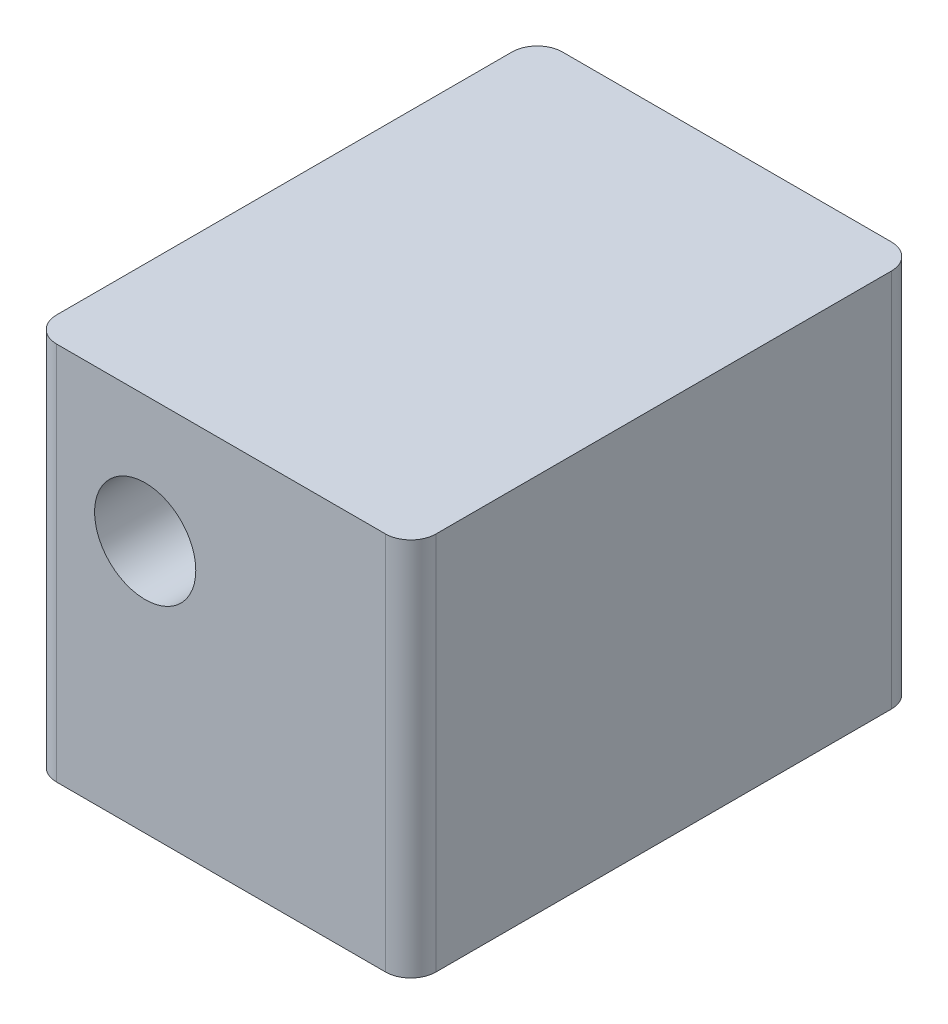
ISO-10303-21;
HEADER;
FILE_DESCRIPTION(('STEP AP214'),'2;1');
FILE_NAME('part.step','',(''),(''),'','','');
FILE_SCHEMA(('AUTOMOTIVE_DESIGN { 1 0 10303 214 1 1 1 1 }'));
ENDSEC;
DATA;
#1=APPLICATION_CONTEXT('core data for automotive mechanical design processes');
#2=APPLICATION_PROTOCOL_DEFINITION('international standard','automotive_design',2000,#1);
#3=PRODUCT_CONTEXT('',#1,'mechanical');
#4=PRODUCT('Part','Part','',(#3));
#5=PRODUCT_RELATED_PRODUCT_CATEGORY('part','',(#4));
#6=PRODUCT_DEFINITION_FORMATION('','',#4);
#7=PRODUCT_DEFINITION_CONTEXT('part definition',#1,'design');
#8=PRODUCT_DEFINITION('design','',#6,#7);
#9=PRODUCT_DEFINITION_SHAPE('','',#8);
#10=(LENGTH_UNIT() NAMED_UNIT(*) SI_UNIT(.MILLI.,.METRE.));
#11=(NAMED_UNIT(*) PLANE_ANGLE_UNIT() SI_UNIT($,.RADIAN.));
#12=(NAMED_UNIT(*) SI_UNIT($,.STERADIAN.) SOLID_ANGLE_UNIT());
#13=UNCERTAINTY_MEASURE_WITH_UNIT(LENGTH_MEASURE(1.E-05),#10,'distance_accuracy_value','');
#14=(GEOMETRIC_REPRESENTATION_CONTEXT(3) GLOBAL_UNCERTAINTY_ASSIGNED_CONTEXT((#13)) GLOBAL_UNIT_ASSIGNED_CONTEXT((#10,
#11,#12)) REPRESENTATION_CONTEXT('',''));
#15=CARTESIAN_POINT('',(0.,0.,0.));
#16=DIRECTION('',(0.,0.,1.));
#17=DIRECTION('',(1.,0.,0.));
#18=AXIS2_PLACEMENT_3D('',#15,#16,#17);
#19=CARTESIAN_POINT('',(0.,15.,0.));
#20=DIRECTION('',(0.,0.,-1.));
#21=DIRECTION('',(-1.,0.,0.));
#22=AXIS2_PLACEMENT_3D('',#19,#20,#21);
#23=PLANE('',#22);
#24=CARTESIAN_POINT('',(-3.,10.,0.));
#25=DIRECTION('',(0.,0.,1.));
#26=DIRECTION('',(1.,0.,0.));
#27=AXIS2_PLACEMENT_3D('',#24,#25,#26);
#28=CIRCLE('',#27,2.);
#29=CARTESIAN_POINT('',(-1.,10.,0.));
#30=VERTEX_POINT('',#29);
#31=EDGE_CURVE('E192',#30,#30,#28,.T.);
#32=ORIENTED_EDGE('',*,*,#31,.F.);
#33=EDGE_LOOP('',(#32));
#34=FACE_BOUND('',#33,.T.);
#35=DIRECTION('',(1.,0.,0.));
#36=VECTOR('',#35,1.);
#37=CARTESIAN_POINT('',(0.,0.,0.));
#38=LINE('',#37,#36);
#39=CARTESIAN_POINT('',(-6.5,0.,0.));
#40=VERTEX_POINT('',#39);
#41=CARTESIAN_POINT('',(6.5,0.,0.));
#42=VERTEX_POINT('',#41);
#43=EDGE_CURVE('E130',#40,#42,#38,.T.);
#44=ORIENTED_EDGE('',*,*,#43,.T.);
#45=DIRECTION('',(0.,-1.,0.));
#46=VECTOR('',#45,1.);
#47=CARTESIAN_POINT('',(6.5,15.,0.));
#48=LINE('',#47,#46);
#49=CARTESIAN_POINT('',(6.5,15.,0.));
#50=VERTEX_POINT('',#49);
#51=EDGE_CURVE('E108',#42,#50,#48,.F.);
#52=ORIENTED_EDGE('',*,*,#51,.T.);
#53=DIRECTION('',(1.,0.,0.));
#54=VECTOR('',#53,1.);
#55=CARTESIAN_POINT('',(0.,15.,0.));
#56=LINE('',#55,#54);
#57=CARTESIAN_POINT('',(-6.5,15.,0.));
#58=VERTEX_POINT('',#57);
#59=EDGE_CURVE('E140',#58,#50,#56,.T.);
#60=ORIENTED_EDGE('',*,*,#59,.F.);
#61=DIRECTION('',(0.,-1.,0.));
#62=VECTOR('',#61,1.);
#63=CARTESIAN_POINT('',(-6.5,15.,0.));
#64=LINE('',#63,#62);
#65=EDGE_CURVE('E113',#58,#40,#64,.T.);
#66=ORIENTED_EDGE('',*,*,#65,.T.);
#67=EDGE_LOOP('',(#44,#52,#60,#66));
#68=FACE_BOUND('',#67,.T.);
#69=ADVANCED_FACE('F37',(#34,#68),#23,.F.);
#70=CARTESIAN_POINT('',(7.5,15.,-20.));
#71=DIRECTION('',(-1.,0.,0.));
#72=DIRECTION('',(0.,0.,1.));
#73=AXIS2_PLACEMENT_3D('',#70,#71,#72);
#74=PLANE('',#73);
#75=DIRECTION('',(0.,0.,-1.));
#76=VECTOR('',#75,1.);
#77=CARTESIAN_POINT('',(7.5,15.,-20.));
#78=LINE('',#77,#76);
#79=CARTESIAN_POINT('',(7.5,15.,-1.));
#80=VERTEX_POINT('',#79);
#81=CARTESIAN_POINT('',(7.5,15.,-19.));
#82=VERTEX_POINT('',#81);
#83=EDGE_CURVE('E123',#80,#82,#78,.T.);
#84=ORIENTED_EDGE('',*,*,#83,.F.);
#85=DIRECTION('',(0.,-1.,0.));
#86=VECTOR('',#85,1.);
#87=CARTESIAN_POINT('',(7.5,15.,-1.));
#88=LINE('',#87,#86);
#89=CARTESIAN_POINT('',(7.5,0.,-1.));
#90=VERTEX_POINT('',#89);
#91=EDGE_CURVE('E107',#80,#90,#88,.T.);
#92=ORIENTED_EDGE('',*,*,#91,.T.);
#93=DIRECTION('',(0.,0.,-1.));
#94=VECTOR('',#93,1.);
#95=CARTESIAN_POINT('',(7.5,0.,-20.));
#96=LINE('',#95,#94);
#97=CARTESIAN_POINT('',(7.5,0.,-19.));
#98=VERTEX_POINT('',#97);
#99=EDGE_CURVE('E120',#90,#98,#96,.T.);
#100=ORIENTED_EDGE('',*,*,#99,.T.);
#101=DIRECTION('',(0.,-1.,0.));
#102=VECTOR('',#101,1.);
#103=CARTESIAN_POINT('',(7.5,15.,-19.));
#104=LINE('',#103,#102);
#105=EDGE_CURVE('E125',#98,#82,#104,.F.);
#106=ORIENTED_EDGE('',*,*,#105,.T.);
#107=EDGE_LOOP('',(#84,#92,#100,#106));
#108=FACE_BOUND('',#107,.T.);
#109=ADVANCED_FACE('F119',(#108),#74,.F.);
#110=CARTESIAN_POINT('',(-7.5,15.,-20.));
#111=DIRECTION('',(0.,0.,1.));
#112=DIRECTION('',(1.,0.,0.));
#113=AXIS2_PLACEMENT_3D('',#110,#111,#112);
#114=PLANE('',#113);
#115=DIRECTION('',(-1.,0.,0.));
#116=VECTOR('',#115,1.);
#117=CARTESIAN_POINT('',(-7.5,15.,-20.));
#118=LINE('',#117,#116);
#119=CARTESIAN_POINT('',(6.5,15.,-20.));
#120=VERTEX_POINT('',#119);
#121=CARTESIAN_POINT('',(-6.5,15.,-20.));
#122=VERTEX_POINT('',#121);
#123=EDGE_CURVE('E166',#120,#122,#118,.T.);
#124=ORIENTED_EDGE('',*,*,#123,.F.);
#125=DIRECTION('',(0.,-1.,0.));
#126=VECTOR('',#125,1.);
#127=CARTESIAN_POINT('',(6.5,15.,-20.));
#128=LINE('',#127,#126);
#129=CARTESIAN_POINT('',(6.5,0.,-20.));
#130=VERTEX_POINT('',#129);
#131=EDGE_CURVE('E159',#120,#130,#128,.T.);
#132=ORIENTED_EDGE('',*,*,#131,.T.);
#133=DIRECTION('',(-1.,0.,0.));
#134=VECTOR('',#133,1.);
#135=CARTESIAN_POINT('',(-7.5,0.,-20.));
#136=LINE('',#135,#134);
#137=CARTESIAN_POINT('',(-6.5,0.,-20.));
#138=VERTEX_POINT('',#137);
#139=EDGE_CURVE('E129',#130,#138,#136,.T.);
#140=ORIENTED_EDGE('',*,*,#139,.T.);
#141=DIRECTION('',(0.,-1.,0.));
#142=VECTOR('',#141,1.);
#143=CARTESIAN_POINT('',(-6.5,15.,-20.));
#144=LINE('',#143,#142);
#145=EDGE_CURVE('E157',#138,#122,#144,.F.);
#146=ORIENTED_EDGE('',*,*,#145,.T.);
#147=EDGE_LOOP('',(#124,#132,#140,#146));
#148=FACE_BOUND('',#147,.T.);
#149=ADVANCED_FACE('F164',(#148),#114,.F.);
#150=CARTESIAN_POINT('',(-7.5,15.,0.));
#151=DIRECTION('',(1.,0.,0.));
#152=DIRECTION('',(0.,0.,-1.));
#153=AXIS2_PLACEMENT_3D('',#150,#151,#152);
#154=PLANE('',#153);
#155=DIRECTION('',(0.,0.,1.));
#156=VECTOR('',#155,1.);
#157=CARTESIAN_POINT('',(-7.5,15.,0.));
#158=LINE('',#157,#156);
#159=CARTESIAN_POINT('',(-7.5,15.,-19.));
#160=VERTEX_POINT('',#159);
#161=CARTESIAN_POINT('',(-7.5,15.,-1.));
#162=VERTEX_POINT('',#161);
#163=EDGE_CURVE('E141',#160,#162,#158,.T.);
#164=ORIENTED_EDGE('',*,*,#163,.F.);
#165=DIRECTION('',(0.,-1.,0.));
#166=VECTOR('',#165,1.);
#167=CARTESIAN_POINT('',(-7.5,15.,-19.));
#168=LINE('',#167,#166);
#169=CARTESIAN_POINT('',(-7.5,0.,-19.));
#170=VERTEX_POINT('',#169);
#171=EDGE_CURVE('E11',#160,#170,#168,.T.);
#172=ORIENTED_EDGE('',*,*,#171,.T.);
#173=DIRECTION('',(0.,0.,1.));
#174=VECTOR('',#173,1.);
#175=CARTESIAN_POINT('',(-7.5,0.,0.));
#176=LINE('',#175,#174);
#177=CARTESIAN_POINT('',(-7.5,0.,-1.));
#178=VERTEX_POINT('',#177);
#179=EDGE_CURVE('E133',#170,#178,#176,.T.);
#180=ORIENTED_EDGE('',*,*,#179,.T.);
#181=DIRECTION('',(0.,-1.,0.));
#182=VECTOR('',#181,1.);
#183=CARTESIAN_POINT('',(-7.5,15.,-1.));
#184=LINE('',#183,#182);
#185=EDGE_CURVE('E45',#178,#162,#184,.F.);
#186=ORIENTED_EDGE('',*,*,#185,.T.);
#187=EDGE_LOOP('',(#164,#172,#180,#186));
#188=FACE_BOUND('',#187,.T.);
#189=ADVANCED_FACE('F173',(#188),#154,.F.);
#190=CARTESIAN_POINT('',(0.,15.,0.));
#191=DIRECTION('',(0.,-1.,0.));
#192=DIRECTION('',(0.,0.,-1.));
#193=AXIS2_PLACEMENT_3D('',#190,#191,#192);
#194=PLANE('',#193);
#195=ORIENTED_EDGE('',*,*,#59,.T.);
#196=CARTESIAN_POINT('',(6.5,15.,-1.));
#197=DIRECTION('',(0.,-1.,0.));
#198=DIRECTION('',(0.,0.,-1.));
#199=AXIS2_PLACEMENT_3D('',#196,#197,#198);
#200=CIRCLE('',#199,1.);
#201=EDGE_CURVE('E155',#50,#80,#200,.F.);
#202=ORIENTED_EDGE('',*,*,#201,.T.);
#203=ORIENTED_EDGE('',*,*,#83,.T.);
#204=CARTESIAN_POINT('',(6.5,15.,-19.));
#205=DIRECTION('',(0.,-1.,0.));
#206=DIRECTION('',(0.,0.,-1.));
#207=AXIS2_PLACEMENT_3D('',#204,#205,#206);
#208=CIRCLE('',#207,1.);
#209=EDGE_CURVE('E153',#82,#120,#208,.F.);
#210=ORIENTED_EDGE('',*,*,#209,.T.);
#211=ORIENTED_EDGE('',*,*,#123,.T.);
#212=CARTESIAN_POINT('',(-6.5,15.,-19.));
#213=DIRECTION('',(0.,-1.,0.));
#214=DIRECTION('',(0.,0.,-1.));
#215=AXIS2_PLACEMENT_3D('',#212,#213,#214);
#216=CIRCLE('',#215,1.);
#217=EDGE_CURVE('E58',#122,#160,#216,.F.);
#218=ORIENTED_EDGE('',*,*,#217,.T.);
#219=ORIENTED_EDGE('',*,*,#163,.T.);
#220=CARTESIAN_POINT('',(-6.5,15.,-1.));
#221=DIRECTION('',(0.,-1.,0.));
#222=DIRECTION('',(0.,0.,-1.));
#223=AXIS2_PLACEMENT_3D('',#220,#221,#222);
#224=CIRCLE('',#223,1.);
#225=EDGE_CURVE('E150',#162,#58,#224,.F.);
#226=ORIENTED_EDGE('',*,*,#225,.T.);
#227=EDGE_LOOP('',(#195,#202,#203,#210,#211,#218,#219,#226));
#228=FACE_BOUND('',#227,.T.);
#229=ADVANCED_FACE('F213',(#228),#194,.F.);
#230=CARTESIAN_POINT('',(0.,0.,0.));
#231=DIRECTION('',(0.,-1.,0.));
#232=DIRECTION('',(0.,0.,-1.));
#233=AXIS2_PLACEMENT_3D('',#230,#231,#232);
#234=PLANE('',#233);
#235=CARTESIAN_POINT('',(-3.,0.,-16.));
#236=DIRECTION('',(0.,-1.,0.));
#237=DIRECTION('',(0.,0.,-1.));
#238=AXIS2_PLACEMENT_3D('',#235,#236,#237);
#239=CIRCLE('',#238,2.);
#240=CARTESIAN_POINT('',(-3.,0.,-18.));
#241=VERTEX_POINT('',#240);
#242=EDGE_CURVE('E187',#241,#241,#239,.T.);
#243=ORIENTED_EDGE('',*,*,#242,.F.);
#244=EDGE_LOOP('',(#243));
#245=FACE_BOUND('',#244,.T.);
#246=CARTESIAN_POINT('',(3.,0.,-4.));
#247=DIRECTION('',(0.,-1.,0.));
#248=DIRECTION('',(0.,0.,-1.));
#249=AXIS2_PLACEMENT_3D('',#246,#247,#248);
#250=CIRCLE('',#249,2.);
#251=CARTESIAN_POINT('',(3.,0.,-6.));
#252=VERTEX_POINT('',#251);
#253=EDGE_CURVE('E180',#252,#252,#250,.T.);
#254=ORIENTED_EDGE('',*,*,#253,.F.);
#255=EDGE_LOOP('',(#254));
#256=FACE_BOUND('',#255,.T.);
#257=ORIENTED_EDGE('',*,*,#99,.F.);
#258=CARTESIAN_POINT('',(6.5,0.,-1.));
#259=DIRECTION('',(0.,-1.,0.));
#260=DIRECTION('',(0.,0.,-1.));
#261=AXIS2_PLACEMENT_3D('',#258,#259,#260);
#262=CIRCLE('',#261,1.);
#263=EDGE_CURVE('E103',#90,#42,#262,.T.);
#264=ORIENTED_EDGE('',*,*,#263,.T.);
#265=ORIENTED_EDGE('',*,*,#43,.F.);
#266=CARTESIAN_POINT('',(-6.5,0.,-1.));
#267=DIRECTION('',(0.,-1.,0.));
#268=DIRECTION('',(0.,0.,-1.));
#269=AXIS2_PLACEMENT_3D('',#266,#267,#268);
#270=CIRCLE('',#269,1.);
#271=EDGE_CURVE('E124',#40,#178,#270,.T.);
#272=ORIENTED_EDGE('',*,*,#271,.T.);
#273=ORIENTED_EDGE('',*,*,#179,.F.);
#274=CARTESIAN_POINT('',(-6.5,0.,-19.));
#275=DIRECTION('',(0.,-1.,0.));
#276=DIRECTION('',(0.,0.,-1.));
#277=AXIS2_PLACEMENT_3D('',#274,#275,#276);
#278=CIRCLE('',#277,1.);
#279=EDGE_CURVE('E144',#170,#138,#278,.T.);
#280=ORIENTED_EDGE('',*,*,#279,.T.);
#281=ORIENTED_EDGE('',*,*,#139,.F.);
#282=CARTESIAN_POINT('',(6.5,0.,-19.));
#283=DIRECTION('',(0.,-1.,0.));
#284=DIRECTION('',(0.,0.,-1.));
#285=AXIS2_PLACEMENT_3D('',#282,#283,#284);
#286=CIRCLE('',#285,1.);
#287=EDGE_CURVE('E114',#130,#98,#286,.T.);
#288=ORIENTED_EDGE('',*,*,#287,.T.);
#289=EDGE_LOOP('',(#257,#264,#265,#272,#273,#280,#281,#288));
#290=FACE_BOUND('',#289,.T.);
#291=ADVANCED_FACE('F127',(#245,#256,#290),#234,.T.);
#292=CARTESIAN_POINT('',(3.,12.,-4.));
#293=DIRECTION('',(0.,-1.,0.));
#294=DIRECTION('',(0.,0.,-1.));
#295=AXIS2_PLACEMENT_3D('',#292,#293,#294);
#296=CYLINDRICAL_SURFACE('',#295,2.);
#297=CARTESIAN_POINT('',(3.,12.,-4.));
#298=DIRECTION('',(0.,-1.,0.));
#299=DIRECTION('',(0.,0.,-1.));
#300=AXIS2_PLACEMENT_3D('',#297,#298,#299);
#301=CIRCLE('',#300,2.);
#302=CARTESIAN_POINT('',(3.,12.,-6.));
#303=VERTEX_POINT('',#302);
#304=EDGE_CURVE('E183',#303,#303,#301,.T.);
#305=ORIENTED_EDGE('',*,*,#304,.F.);
#306=EDGE_LOOP('',(#305));
#307=FACE_BOUND('',#306,.T.);
#308=ORIENTED_EDGE('',*,*,#253,.T.);
#309=EDGE_LOOP('',(#308));
#310=FACE_BOUND('',#309,.T.);
#311=ADVANCED_FACE('F231',(#307,#310),#296,.F.);
#312=CARTESIAN_POINT('',(3.,12.,-4.));
#313=DIRECTION('',(0.,-1.,0.));
#314=DIRECTION('',(0.,0.,-1.));
#315=AXIS2_PLACEMENT_3D('',#312,#313,#314);
#316=PLANE('',#315);
#317=ORIENTED_EDGE('',*,*,#304,.T.);
#318=EDGE_LOOP('',(#317));
#319=FACE_BOUND('',#318,.T.);
#320=ADVANCED_FACE('F237',(#319),#316,.T.);
#321=CARTESIAN_POINT('',(-3.,12.,-16.));
#322=DIRECTION('',(0.,-1.,0.));
#323=DIRECTION('',(0.,0.,-1.));
#324=AXIS2_PLACEMENT_3D('',#321,#322,#323);
#325=CYLINDRICAL_SURFACE('',#324,2.);
#326=CARTESIAN_POINT('',(-3.,12.,-16.));
#327=DIRECTION('',(0.,-1.,0.));
#328=DIRECTION('',(0.,0.,-1.));
#329=AXIS2_PLACEMENT_3D('',#326,#327,#328);
#330=CIRCLE('',#329,2.);
#331=CARTESIAN_POINT('',(-3.,12.,-18.));
#332=VERTEX_POINT('',#331);
#333=EDGE_CURVE('E135',#332,#332,#330,.T.);
#334=ORIENTED_EDGE('',*,*,#333,.F.);
#335=EDGE_LOOP('',(#334));
#336=FACE_BOUND('',#335,.T.);
#337=ORIENTED_EDGE('',*,*,#242,.T.);
#338=EDGE_LOOP('',(#337));
#339=FACE_BOUND('',#338,.T.);
#340=ADVANCED_FACE('F241',(#336,#339),#325,.F.);
#341=CARTESIAN_POINT('',(-3.,12.,-16.));
#342=DIRECTION('',(0.,-1.,0.));
#343=DIRECTION('',(0.,0.,-1.));
#344=AXIS2_PLACEMENT_3D('',#341,#342,#343);
#345=PLANE('',#344);
#346=ORIENTED_EDGE('',*,*,#333,.T.);
#347=EDGE_LOOP('',(#346));
#348=FACE_BOUND('',#347,.T.);
#349=ADVANCED_FACE('F203',(#348),#345,.T.);
#350=CARTESIAN_POINT('',(-3.,10.,-12.));
#351=DIRECTION('',(0.,0.,1.));
#352=DIRECTION('',(1.,0.,0.));
#353=AXIS2_PLACEMENT_3D('',#350,#351,#352);
#354=CYLINDRICAL_SURFACE('',#353,2.);
#355=CARTESIAN_POINT('',(-3.,10.,-12.));
#356=DIRECTION('',(0.,0.,1.));
#357=DIRECTION('',(1.,0.,0.));
#358=AXIS2_PLACEMENT_3D('',#355,#356,#357);
#359=CIRCLE('',#358,2.);
#360=CARTESIAN_POINT('',(-1.,10.,-12.));
#361=VERTEX_POINT('',#360);
#362=EDGE_CURVE('E184',#361,#361,#359,.T.);
#363=ORIENTED_EDGE('',*,*,#362,.F.);
#364=EDGE_LOOP('',(#363));
#365=FACE_BOUND('',#364,.T.);
#366=ORIENTED_EDGE('',*,*,#31,.T.);
#367=EDGE_LOOP('',(#366));
#368=FACE_BOUND('',#367,.T.);
#369=ADVANCED_FACE('F200',(#365,#368),#354,.F.);
#370=CARTESIAN_POINT('',(-3.,10.,-12.));
#371=DIRECTION('',(0.,0.,1.));
#372=DIRECTION('',(1.,0.,0.));
#373=AXIS2_PLACEMENT_3D('',#370,#371,#372);
#374=PLANE('',#373);
#375=ORIENTED_EDGE('',*,*,#362,.T.);
#376=EDGE_LOOP('',(#375));
#377=FACE_BOUND('',#376,.T.);
#378=ADVANCED_FACE('F198',(#377),#374,.T.);
#379=CARTESIAN_POINT('',(6.5,15.,-1.));
#380=DIRECTION('',(0.,-1.,0.));
#381=DIRECTION('',(0.,0.,-1.));
#382=AXIS2_PLACEMENT_3D('',#379,#380,#381);
#383=CYLINDRICAL_SURFACE('',#382,1.);
#384=ORIENTED_EDGE('',*,*,#201,.F.);
#385=ORIENTED_EDGE('',*,*,#51,.F.);
#386=ORIENTED_EDGE('',*,*,#263,.F.);
#387=ORIENTED_EDGE('',*,*,#91,.F.);
#388=EDGE_LOOP('',(#384,#385,#386,#387));
#389=FACE_BOUND('',#388,.T.);
#390=ADVANCED_FACE('F106',(#389),#383,.T.);
#391=CARTESIAN_POINT('',(6.5,15.,-19.));
#392=DIRECTION('',(0.,-1.,0.));
#393=DIRECTION('',(0.,0.,-1.));
#394=AXIS2_PLACEMENT_3D('',#391,#392,#393);
#395=CYLINDRICAL_SURFACE('',#394,1.);
#396=ORIENTED_EDGE('',*,*,#209,.F.);
#397=ORIENTED_EDGE('',*,*,#105,.F.);
#398=ORIENTED_EDGE('',*,*,#287,.F.);
#399=ORIENTED_EDGE('',*,*,#131,.F.);
#400=EDGE_LOOP('',(#396,#397,#398,#399));
#401=FACE_BOUND('',#400,.T.);
#402=ADVANCED_FACE('F214',(#401),#395,.T.);
#403=CARTESIAN_POINT('',(-6.5,15.,-19.));
#404=DIRECTION('',(0.,-1.,0.));
#405=DIRECTION('',(0.,0.,-1.));
#406=AXIS2_PLACEMENT_3D('',#403,#404,#405);
#407=CYLINDRICAL_SURFACE('',#406,1.);
#408=ORIENTED_EDGE('',*,*,#217,.F.);
#409=ORIENTED_EDGE('',*,*,#145,.F.);
#410=ORIENTED_EDGE('',*,*,#279,.F.);
#411=ORIENTED_EDGE('',*,*,#171,.F.);
#412=EDGE_LOOP('',(#408,#409,#410,#411));
#413=FACE_BOUND('',#412,.T.);
#414=ADVANCED_FACE('F172',(#413),#407,.T.);
#415=CARTESIAN_POINT('',(-6.5,15.,-1.));
#416=DIRECTION('',(0.,-1.,0.));
#417=DIRECTION('',(0.,0.,-1.));
#418=AXIS2_PLACEMENT_3D('',#415,#416,#417);
#419=CYLINDRICAL_SURFACE('',#418,1.);
#420=ORIENTED_EDGE('',*,*,#225,.F.);
#421=ORIENTED_EDGE('',*,*,#185,.F.);
#422=ORIENTED_EDGE('',*,*,#271,.F.);
#423=ORIENTED_EDGE('',*,*,#65,.F.);
#424=EDGE_LOOP('',(#420,#421,#422,#423));
#425=FACE_BOUND('',#424,.T.);
#426=ADVANCED_FACE('F39',(#425),#419,.T.);
#427=CLOSED_SHELL('',(#69,#109,#149,#189,#229,#291,#311,#320,#340,#349,#369,#378,#390,#402,#414,#426));
#428=MANIFOLD_SOLID_BREP('B2',#427);
#429=ADVANCED_BREP_SHAPE_REPRESENTATION('',(#18,#428),#14);
#430=SHAPE_DEFINITION_REPRESENTATION(#9,#429);
ENDSEC;
END-ISO-10303-21;
